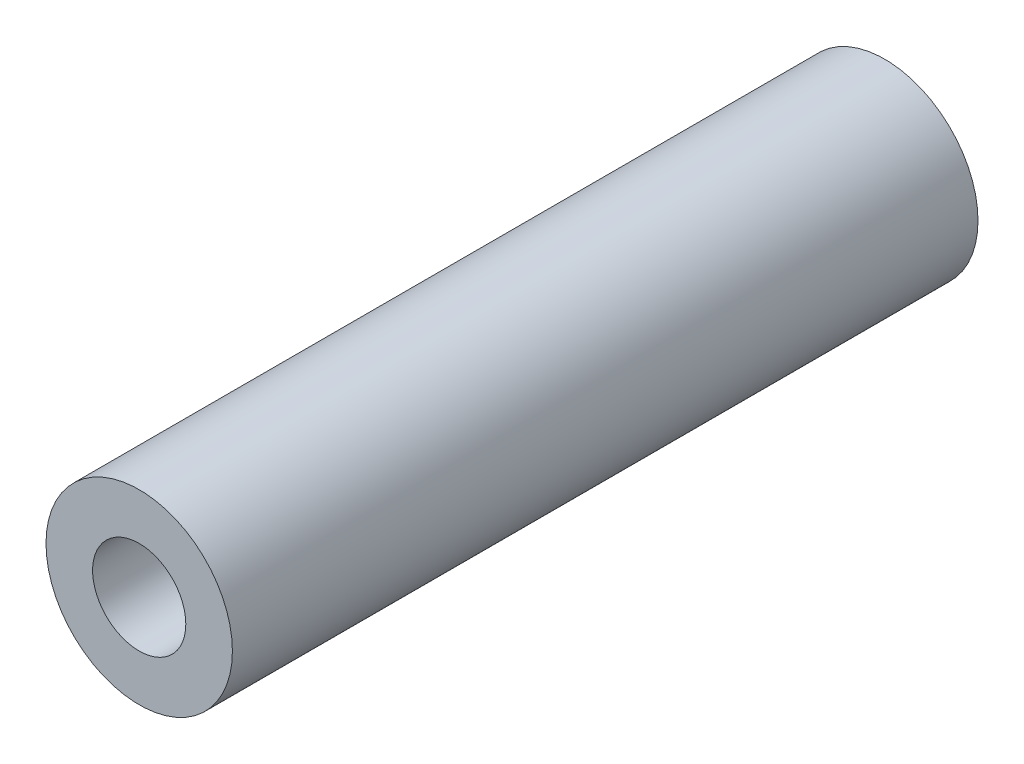
ISO-10303-21;
HEADER;
FILE_DESCRIPTION(('STEP AP214'),'2;1');
FILE_NAME('part.step','',(''),(''),'','','');
FILE_SCHEMA(('AUTOMOTIVE_DESIGN { 1 0 10303 214 1 1 1 1 }'));
ENDSEC;
DATA;
#1=APPLICATION_CONTEXT('core data for automotive mechanical design processes');
#2=APPLICATION_PROTOCOL_DEFINITION('international standard','automotive_design',2000,#1);
#3=PRODUCT_CONTEXT('',#1,'mechanical');
#4=PRODUCT('Part','Part','',(#3));
#5=PRODUCT_RELATED_PRODUCT_CATEGORY('part','',(#4));
#6=PRODUCT_DEFINITION_FORMATION('','',#4);
#7=PRODUCT_DEFINITION_CONTEXT('part definition',#1,'design');
#8=PRODUCT_DEFINITION('design','',#6,#7);
#9=PRODUCT_DEFINITION_SHAPE('','',#8);
#10=(LENGTH_UNIT() NAMED_UNIT(*) SI_UNIT(.MILLI.,.METRE.));
#11=(NAMED_UNIT(*) PLANE_ANGLE_UNIT() SI_UNIT($,.RADIAN.));
#12=(NAMED_UNIT(*) SI_UNIT($,.STERADIAN.) SOLID_ANGLE_UNIT());
#13=UNCERTAINTY_MEASURE_WITH_UNIT(LENGTH_MEASURE(1.E-05),#10,'distance_accuracy_value','');
#14=(GEOMETRIC_REPRESENTATION_CONTEXT(3) GLOBAL_UNCERTAINTY_ASSIGNED_CONTEXT((#13)) GLOBAL_UNIT_ASSIGNED_CONTEXT((#10,
#11,#12)) REPRESENTATION_CONTEXT('',''));
#15=CARTESIAN_POINT('',(0.,0.,0.));
#16=DIRECTION('',(0.,0.,1.));
#17=DIRECTION('',(1.,0.,0.));
#18=AXIS2_PLACEMENT_3D('',#15,#16,#17);
#19=CARTESIAN_POINT('',(184.267611591228,120.11918000865,20.));
#20=DIRECTION('',(0.,0.,1.));
#21=DIRECTION('',(1.,0.,0.));
#22=AXIS2_PLACEMENT_3D('',#19,#20,#21);
#23=PLANE('',#22);
#24=CARTESIAN_POINT('',(184.267611591228,120.11918000865,20.));
#25=DIRECTION('',(0.,0.,1.));
#26=DIRECTION('',(1.,0.,0.));
#27=AXIS2_PLACEMENT_3D('',#24,#25,#26);
#28=CIRCLE('',#27,2.5);
#29=CARTESIAN_POINT('',(186.767611591228,120.11918000865,20.));
#30=VERTEX_POINT('',#29);
#31=EDGE_CURVE('E10',#30,#30,#28,.T.);
#32=ORIENTED_EDGE('',*,*,#31,.T.);
#33=EDGE_LOOP('',(#32));
#34=FACE_BOUND('',#33,.T.);
#35=CARTESIAN_POINT('',(184.267611591228,120.11918000865,20.));
#36=DIRECTION('',(0.,0.,1.));
#37=DIRECTION('',(1.,0.,0.));
#38=AXIS2_PLACEMENT_3D('',#35,#36,#37);
#39=CIRCLE('',#38,1.25000000000001);
#40=CARTESIAN_POINT('',(185.517611591228,120.11918000865,20.));
#41=VERTEX_POINT('',#40);
#42=EDGE_CURVE('E42',#41,#41,#39,.T.);
#43=ORIENTED_EDGE('',*,*,#42,.F.);
#44=EDGE_LOOP('',(#43));
#45=FACE_BOUND('',#44,.T.);
#46=ADVANCED_FACE('F31',(#34,#45),#23,.T.);
#47=CARTESIAN_POINT('',(184.267611591228,120.11918000865,0.));
#48=DIRECTION('',(0.,0.,1.));
#49=DIRECTION('',(1.,0.,0.));
#50=AXIS2_PLACEMENT_3D('',#47,#48,#49);
#51=PLANE('',#50);
#52=CARTESIAN_POINT('',(184.267611591228,120.11918000865,0.));
#53=DIRECTION('',(0.,0.,1.));
#54=DIRECTION('',(1.,0.,0.));
#55=AXIS2_PLACEMENT_3D('',#52,#53,#54);
#56=CIRCLE('',#55,2.5);
#57=CARTESIAN_POINT('',(186.767611591228,120.11918000865,0.));
#58=VERTEX_POINT('',#57);
#59=EDGE_CURVE('E35',#58,#58,#56,.T.);
#60=ORIENTED_EDGE('',*,*,#59,.F.);
#61=EDGE_LOOP('',(#60));
#62=FACE_BOUND('',#61,.T.);
#63=CARTESIAN_POINT('',(184.267611591228,120.11918000865,0.));
#64=DIRECTION('',(0.,0.,1.));
#65=DIRECTION('',(1.,0.,0.));
#66=AXIS2_PLACEMENT_3D('',#63,#64,#65);
#67=CIRCLE('',#66,1.25000000000001);
#68=CARTESIAN_POINT('',(185.517611591228,120.11918000865,0.));
#69=VERTEX_POINT('',#68);
#70=EDGE_CURVE('E44',#69,#69,#67,.T.);
#71=ORIENTED_EDGE('',*,*,#70,.T.);
#72=EDGE_LOOP('',(#71));
#73=FACE_BOUND('',#72,.T.);
#74=ADVANCED_FACE('F54',(#62,#73),#51,.F.);
#75=CARTESIAN_POINT('',(184.267611591228,120.11918000865,20.));
#76=DIRECTION('',(0.,0.,-1.));
#77=DIRECTION('',(-1.,0.,0.));
#78=AXIS2_PLACEMENT_3D('',#75,#76,#77);
#79=CYLINDRICAL_SURFACE('',#78,2.5);
#80=ORIENTED_EDGE('',*,*,#31,.F.);
#81=EDGE_LOOP('',(#80));
#82=FACE_BOUND('',#81,.T.);
#83=ORIENTED_EDGE('',*,*,#59,.T.);
#84=EDGE_LOOP('',(#83));
#85=FACE_BOUND('',#84,.T.);
#86=ADVANCED_FACE('F33',(#82,#85),#79,.T.);
#87=CARTESIAN_POINT('',(184.267611591228,120.11918000865,20.));
#88=DIRECTION('',(0.,0.,-1.));
#89=DIRECTION('',(-1.,0.,0.));
#90=AXIS2_PLACEMENT_3D('',#87,#88,#89);
#91=CYLINDRICAL_SURFACE('',#90,1.25000000000001);
#92=ORIENTED_EDGE('',*,*,#42,.T.);
#93=EDGE_LOOP('',(#92));
#94=FACE_BOUND('',#93,.T.);
#95=ORIENTED_EDGE('',*,*,#70,.F.);
#96=EDGE_LOOP('',(#95));
#97=FACE_BOUND('',#96,.T.);
#98=ADVANCED_FACE('F50',(#94,#97),#91,.F.);
#99=CLOSED_SHELL('',(#46,#74,#86,#98));
#100=MANIFOLD_SOLID_BREP('B2',#99);
#101=ADVANCED_BREP_SHAPE_REPRESENTATION('',(#18,#100),#14);
#102=SHAPE_DEFINITION_REPRESENTATION(#9,#101);
ENDSEC;
END-ISO-10303-21;
